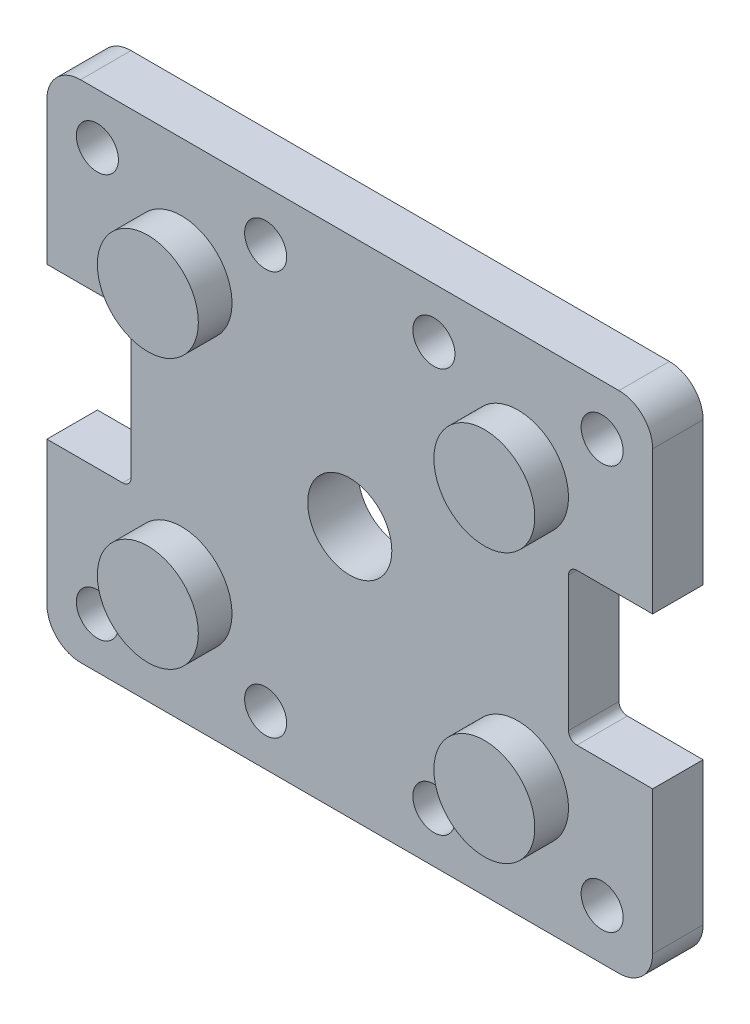
ISO-10303-21;
HEADER;
FILE_DESCRIPTION(('STEP AP214'),'2;1');
FILE_NAME('part.step','',(''),(''),'','','');
FILE_SCHEMA(('AUTOMOTIVE_DESIGN { 1 0 10303 214 1 1 1 1 }'));
ENDSEC;
DATA;
#1=APPLICATION_CONTEXT('core data for automotive mechanical design processes');
#2=APPLICATION_PROTOCOL_DEFINITION('international standard','automotive_design',2000,#1);
#3=PRODUCT_CONTEXT('',#1,'mechanical');
#4=PRODUCT('Part','Part','',(#3));
#5=PRODUCT_RELATED_PRODUCT_CATEGORY('part','',(#4));
#6=PRODUCT_DEFINITION_FORMATION('','',#4);
#7=PRODUCT_DEFINITION_CONTEXT('part definition',#1,'design');
#8=PRODUCT_DEFINITION('design','',#6,#7);
#9=PRODUCT_DEFINITION_SHAPE('','',#8);
#10=(LENGTH_UNIT() NAMED_UNIT(*) SI_UNIT(.MILLI.,.METRE.));
#11=(NAMED_UNIT(*) PLANE_ANGLE_UNIT() SI_UNIT($,.RADIAN.));
#12=(NAMED_UNIT(*) SI_UNIT($,.STERADIAN.) SOLID_ANGLE_UNIT());
#13=UNCERTAINTY_MEASURE_WITH_UNIT(LENGTH_MEASURE(1.E-05),#10,'distance_accuracy_value','');
#14=(GEOMETRIC_REPRESENTATION_CONTEXT(3) GLOBAL_UNCERTAINTY_ASSIGNED_CONTEXT((#13)) GLOBAL_UNIT_ASSIGNED_CONTEXT((#10,
#11,#12)) REPRESENTATION_CONTEXT('',''));
#15=CARTESIAN_POINT('',(0.,0.,0.));
#16=DIRECTION('',(0.,0.,1.));
#17=DIRECTION('',(1.,0.,0.));
#18=AXIS2_PLACEMENT_3D('',#15,#16,#17);
#19=CARTESIAN_POINT('',(36.,0.,3.));
#20=DIRECTION('',(-1.,0.,0.));
#21=DIRECTION('',(0.,0.,1.));
#22=AXIS2_PLACEMENT_3D('',#19,#20,#21);
#23=PLANE('',#22);
#24=DIRECTION('',(0.,1.,0.));
#25=VECTOR('',#24,1.);
#26=CARTESIAN_POINT('',(36.,0.,3.));
#27=LINE('',#26,#25);
#28=CARTESIAN_POINT('',(36.,2.,3.));
#29=VERTEX_POINT('',#28);
#30=CARTESIAN_POINT('',(36.,10.5,3.));
#31=VERTEX_POINT('',#30);
#32=EDGE_CURVE('E253',#29,#31,#27,.T.);
#33=ORIENTED_EDGE('',*,*,#32,.F.);
#34=DIRECTION('',(0.,0.,-1.));
#35=VECTOR('',#34,1.);
#36=CARTESIAN_POINT('',(36.,2.,3.));
#37=LINE('',#36,#35);
#38=CARTESIAN_POINT('',(36.,2.,0.));
#39=VERTEX_POINT('',#38);
#40=EDGE_CURVE('E182',#29,#39,#37,.T.);
#41=ORIENTED_EDGE('',*,*,#40,.T.);
#42=DIRECTION('',(0.,1.,0.));
#43=VECTOR('',#42,1.);
#44=CARTESIAN_POINT('',(36.,0.,0.));
#45=LINE('',#44,#43);
#46=CARTESIAN_POINT('',(36.,10.5,0.));
#47=VERTEX_POINT('',#46);
#48=EDGE_CURVE('E176',#39,#47,#45,.T.);
#49=ORIENTED_EDGE('',*,*,#48,.T.);
#50=DIRECTION('',(0.,0.,1.));
#51=VECTOR('',#50,1.);
#52=CARTESIAN_POINT('',(36.,10.5,0.));
#53=LINE('',#52,#51);
#54=EDGE_CURVE('E180',#47,#31,#53,.T.);
#55=ORIENTED_EDGE('',*,*,#54,.T.);
#56=EDGE_LOOP('',(#33,#41,#49,#55));
#57=FACE_BOUND('',#56,.T.);
#58=ADVANCED_FACE('F36',(#57),#23,.F.);
#59=CARTESIAN_POINT('',(0.,0.,3.));
#60=DIRECTION('',(1.,0.,0.));
#61=DIRECTION('',(0.,0.,-1.));
#62=AXIS2_PLACEMENT_3D('',#59,#60,#61);
#63=PLANE('',#62);
#64=DIRECTION('',(0.,-1.,0.));
#65=VECTOR('',#64,1.);
#66=CARTESIAN_POINT('',(0.,0.,3.));
#67=LINE('',#66,#65);
#68=CARTESIAN_POINT('',(0.,28.,3.));
#69=VERTEX_POINT('',#68);
#70=CARTESIAN_POINT('',(0.,19.5,3.));
#71=VERTEX_POINT('',#70);
#72=EDGE_CURVE('E246',#69,#71,#67,.T.);
#73=ORIENTED_EDGE('',*,*,#72,.F.);
#74=DIRECTION('',(0.,0.,-1.));
#75=VECTOR('',#74,1.);
#76=CARTESIAN_POINT('',(0.,28.,3.));
#77=LINE('',#76,#75);
#78=CARTESIAN_POINT('',(0.,28.,0.));
#79=VERTEX_POINT('',#78);
#80=EDGE_CURVE('E332',#69,#79,#77,.T.);
#81=ORIENTED_EDGE('',*,*,#80,.T.);
#82=DIRECTION('',(0.,-1.,0.));
#83=VECTOR('',#82,1.);
#84=CARTESIAN_POINT('',(0.,0.,0.));
#85=LINE('',#84,#83);
#86=CARTESIAN_POINT('',(0.,19.5,0.));
#87=VERTEX_POINT('',#86);
#88=EDGE_CURVE('E258',#79,#87,#85,.T.);
#89=ORIENTED_EDGE('',*,*,#88,.T.);
#90=DIRECTION('',(0.,0.,1.));
#91=VECTOR('',#90,1.);
#92=CARTESIAN_POINT('',(0.,19.5,0.));
#93=LINE('',#92,#91);
#94=EDGE_CURVE('E229',#87,#71,#93,.T.);
#95=ORIENTED_EDGE('',*,*,#94,.T.);
#96=EDGE_LOOP('',(#73,#81,#89,#95));
#97=FACE_BOUND('',#96,.T.);
#98=ADVANCED_FACE('F351',(#97),#63,.F.);
#99=CARTESIAN_POINT('',(0.,10.5,0.));
#100=VERTEX_POINT('',#99);
#101=CARTESIAN_POINT('',(0.,2.,0.));
#102=VERTEX_POINT('',#101);
#103=EDGE_CURVE('E245',#100,#102,#85,.T.);
#104=ORIENTED_EDGE('',*,*,#103,.T.);
#105=DIRECTION('',(0.,0.,-1.));
#106=VECTOR('',#105,1.);
#107=CARTESIAN_POINT('',(0.,2.,3.));
#108=LINE('',#107,#106);
#109=CARTESIAN_POINT('',(0.,2.,3.));
#110=VERTEX_POINT('',#109);
#111=EDGE_CURVE('E51',#102,#110,#108,.F.);
#112=ORIENTED_EDGE('',*,*,#111,.T.);
#113=CARTESIAN_POINT('',(0.,10.5,3.));
#114=VERTEX_POINT('',#113);
#115=EDGE_CURVE('E249',#114,#110,#67,.T.);
#116=ORIENTED_EDGE('',*,*,#115,.F.);
#117=DIRECTION('',(0.,0.,1.));
#118=VECTOR('',#117,1.);
#119=CARTESIAN_POINT('',(0.,10.5,0.));
#120=LINE('',#119,#118);
#121=EDGE_CURVE('E221',#100,#114,#120,.T.);
#122=ORIENTED_EDGE('',*,*,#121,.F.);
#123=EDGE_LOOP('',(#104,#112,#116,#122));
#124=FACE_BOUND('',#123,.T.);
#125=ADVANCED_FACE('F388',(#124),#63,.F.);
#126=CARTESIAN_POINT('',(0.,0.,3.));
#127=DIRECTION('',(0.,1.,0.));
#128=DIRECTION('',(0.,0.,1.));
#129=AXIS2_PLACEMENT_3D('',#126,#127,#128);
#130=PLANE('',#129);
#131=DIRECTION('',(1.,0.,0.));
#132=VECTOR('',#131,1.);
#133=CARTESIAN_POINT('',(0.,0.,0.));
#134=LINE('',#133,#132);
#135=CARTESIAN_POINT('',(2.,0.,0.));
#136=VERTEX_POINT('',#135);
#137=CARTESIAN_POINT('',(34.,0.,0.));
#138=VERTEX_POINT('',#137);
#139=EDGE_CURVE('E260',#136,#138,#134,.T.);
#140=ORIENTED_EDGE('',*,*,#139,.T.);
#141=DIRECTION('',(0.,0.,-1.));
#142=VECTOR('',#141,1.);
#143=CARTESIAN_POINT('',(34.,0.,3.));
#144=LINE('',#143,#142);
#145=CARTESIAN_POINT('',(34.,0.,3.));
#146=VERTEX_POINT('',#145);
#147=EDGE_CURVE('E322',#138,#146,#144,.F.);
#148=ORIENTED_EDGE('',*,*,#147,.T.);
#149=DIRECTION('',(1.,0.,0.));
#150=VECTOR('',#149,1.);
#151=CARTESIAN_POINT('',(0.,0.,3.));
#152=LINE('',#151,#150);
#153=CARTESIAN_POINT('',(2.,0.,3.));
#154=VERTEX_POINT('',#153);
#155=EDGE_CURVE('E248',#154,#146,#152,.T.);
#156=ORIENTED_EDGE('',*,*,#155,.F.);
#157=DIRECTION('',(0.,0.,-1.));
#158=VECTOR('',#157,1.);
#159=CARTESIAN_POINT('',(2.,0.,3.));
#160=LINE('',#159,#158);
#161=EDGE_CURVE('E319',#154,#136,#160,.T.);
#162=ORIENTED_EDGE('',*,*,#161,.T.);
#163=EDGE_LOOP('',(#140,#148,#156,#162));
#164=FACE_BOUND('',#163,.T.);
#165=ADVANCED_FACE('F393',(#164),#130,.F.);
#166=CARTESIAN_POINT('',(36.,19.5,0.));
#167=VERTEX_POINT('',#166);
#168=CARTESIAN_POINT('',(36.,28.,0.));
#169=VERTEX_POINT('',#168);
#170=EDGE_CURVE('E185',#167,#169,#45,.T.);
#171=ORIENTED_EDGE('',*,*,#170,.T.);
#172=DIRECTION('',(0.,0.,-1.));
#173=VECTOR('',#172,1.);
#174=CARTESIAN_POINT('',(36.,28.,3.));
#175=LINE('',#174,#173);
#176=CARTESIAN_POINT('',(36.,28.,3.));
#177=VERTEX_POINT('',#176);
#178=EDGE_CURVE('E11',#169,#177,#175,.F.);
#179=ORIENTED_EDGE('',*,*,#178,.T.);
#180=CARTESIAN_POINT('',(36.,19.5,3.));
#181=VERTEX_POINT('',#180);
#182=EDGE_CURVE('E252',#181,#177,#27,.T.);
#183=ORIENTED_EDGE('',*,*,#182,.F.);
#184=DIRECTION('',(0.,0.,1.));
#185=VECTOR('',#184,1.);
#186=CARTESIAN_POINT('',(36.,19.5,0.));
#187=LINE('',#186,#185);
#188=EDGE_CURVE('E203',#167,#181,#187,.T.);
#189=ORIENTED_EDGE('',*,*,#188,.F.);
#190=EDGE_LOOP('',(#171,#179,#183,#189));
#191=FACE_BOUND('',#190,.T.);
#192=ADVANCED_FACE('F384',(#191),#23,.F.);
#193=CARTESIAN_POINT('',(0.,30.,3.));
#194=DIRECTION('',(0.,-1.,0.));
#195=DIRECTION('',(0.,0.,-1.));
#196=AXIS2_PLACEMENT_3D('',#193,#194,#195);
#197=PLANE('',#196);
#198=DIRECTION('',(-1.,0.,0.));
#199=VECTOR('',#198,1.);
#200=CARTESIAN_POINT('',(0.,30.,0.));
#201=LINE('',#200,#199);
#202=CARTESIAN_POINT('',(34.,30.,0.));
#203=VERTEX_POINT('',#202);
#204=CARTESIAN_POINT('',(2.,30.,0.));
#205=VERTEX_POINT('',#204);
#206=EDGE_CURVE('E184',#203,#205,#201,.T.);
#207=ORIENTED_EDGE('',*,*,#206,.T.);
#208=DIRECTION('',(0.,0.,-1.));
#209=VECTOR('',#208,1.);
#210=CARTESIAN_POINT('',(2.,30.,3.));
#211=LINE('',#210,#209);
#212=CARTESIAN_POINT('',(2.,30.,3.));
#213=VERTEX_POINT('',#212);
#214=EDGE_CURVE('E44',#205,#213,#211,.F.);
#215=ORIENTED_EDGE('',*,*,#214,.T.);
#216=DIRECTION('',(-1.,0.,0.));
#217=VECTOR('',#216,1.);
#218=CARTESIAN_POINT('',(0.,30.,3.));
#219=LINE('',#218,#217);
#220=CARTESIAN_POINT('',(34.,30.,3.));
#221=VERTEX_POINT('',#220);
#222=EDGE_CURVE('E255',#221,#213,#219,.T.);
#223=ORIENTED_EDGE('',*,*,#222,.F.);
#224=DIRECTION('',(0.,0.,-1.));
#225=VECTOR('',#224,1.);
#226=CARTESIAN_POINT('',(34.,30.,3.));
#227=LINE('',#226,#225);
#228=EDGE_CURVE('E335',#221,#203,#227,.T.);
#229=ORIENTED_EDGE('',*,*,#228,.T.);
#230=EDGE_LOOP('',(#207,#215,#223,#229));
#231=FACE_BOUND('',#230,.T.);
#232=ADVANCED_FACE('F340',(#231),#197,.F.);
#233=CARTESIAN_POINT('',(0.,0.,3.));
#234=DIRECTION('',(0.,0.,-1.));
#235=DIRECTION('',(-1.,0.,0.));
#236=AXIS2_PLACEMENT_3D('',#233,#234,#235);
#237=PLANE('',#236);
#238=CARTESIAN_POINT('',(3.,27.,3.));
#239=DIRECTION('',(0.,0.,1.));
#240=DIRECTION('',(1.,0.,0.));
#241=AXIS2_PLACEMENT_3D('',#238,#239,#240);
#242=CIRCLE('',#241,1.25);
#243=CARTESIAN_POINT('',(4.25,27.,3.));
#244=VERTEX_POINT('',#243);
#245=EDGE_CURVE('E853',#244,#244,#242,.T.);
#246=ORIENTED_EDGE('',*,*,#245,.F.);
#247=EDGE_LOOP('',(#246));
#248=FACE_BOUND('',#247,.T.);
#249=CARTESIAN_POINT('',(13.,27.,3.));
#250=DIRECTION('',(0.,0.,1.));
#251=DIRECTION('',(1.,0.,0.));
#252=AXIS2_PLACEMENT_3D('',#249,#250,#251);
#253=CIRCLE('',#252,1.25);
#254=CARTESIAN_POINT('',(14.25,27.,3.));
#255=VERTEX_POINT('',#254);
#256=EDGE_CURVE('E849',#255,#255,#253,.T.);
#257=ORIENTED_EDGE('',*,*,#256,.F.);
#258=EDGE_LOOP('',(#257));
#259=FACE_BOUND('',#258,.T.);
#260=CARTESIAN_POINT('',(23.,27.,3.));
#261=DIRECTION('',(0.,0.,1.));
#262=DIRECTION('',(1.,0.,0.));
#263=AXIS2_PLACEMENT_3D('',#260,#261,#262);
#264=CIRCLE('',#263,1.25);
#265=CARTESIAN_POINT('',(24.25,27.,3.));
#266=VERTEX_POINT('',#265);
#267=EDGE_CURVE('E845',#266,#266,#264,.T.);
#268=ORIENTED_EDGE('',*,*,#267,.F.);
#269=EDGE_LOOP('',(#268));
#270=FACE_BOUND('',#269,.T.);
#271=CARTESIAN_POINT('',(33.,27.,3.));
#272=DIRECTION('',(0.,0.,1.));
#273=DIRECTION('',(1.,0.,0.));
#274=AXIS2_PLACEMENT_3D('',#271,#272,#273);
#275=CIRCLE('',#274,1.25);
#276=CARTESIAN_POINT('',(34.25,27.,3.));
#277=VERTEX_POINT('',#276);
#278=EDGE_CURVE('E841',#277,#277,#275,.T.);
#279=ORIENTED_EDGE('',*,*,#278,.F.);
#280=EDGE_LOOP('',(#279));
#281=FACE_BOUND('',#280,.T.);
#282=CARTESIAN_POINT('',(33.,3.,3.));
#283=DIRECTION('',(0.,0.,1.));
#284=DIRECTION('',(1.,0.,0.));
#285=AXIS2_PLACEMENT_3D('',#282,#283,#284);
#286=CIRCLE('',#285,1.25);
#287=CARTESIAN_POINT('',(34.25,3.,3.));
#288=VERTEX_POINT('',#287);
#289=EDGE_CURVE('E837',#288,#288,#286,.T.);
#290=ORIENTED_EDGE('',*,*,#289,.F.);
#291=EDGE_LOOP('',(#290));
#292=FACE_BOUND('',#291,.T.);
#293=CARTESIAN_POINT('',(23.,3.,3.));
#294=DIRECTION('',(0.,0.,1.));
#295=DIRECTION('',(1.,0.,0.));
#296=AXIS2_PLACEMENT_3D('',#293,#294,#295);
#297=CIRCLE('',#296,1.25);
#298=CARTESIAN_POINT('',(24.25,3.,3.));
#299=VERTEX_POINT('',#298);
#300=EDGE_CURVE('E826',#299,#299,#297,.T.);
#301=ORIENTED_EDGE('',*,*,#300,.F.);
#302=EDGE_LOOP('',(#301));
#303=FACE_BOUND('',#302,.T.);
#304=CARTESIAN_POINT('',(13.,3.,3.));
#305=DIRECTION('',(0.,0.,1.));
#306=DIRECTION('',(1.,0.,0.));
#307=AXIS2_PLACEMENT_3D('',#304,#305,#306);
#308=CIRCLE('',#307,1.25);
#309=CARTESIAN_POINT('',(14.25,3.,3.));
#310=VERTEX_POINT('',#309);
#311=EDGE_CURVE('E821',#310,#310,#308,.T.);
#312=ORIENTED_EDGE('',*,*,#311,.F.);
#313=EDGE_LOOP('',(#312));
#314=FACE_BOUND('',#313,.T.);
#315=CARTESIAN_POINT('',(3.,3.,3.));
#316=DIRECTION('',(0.,0.,1.));
#317=DIRECTION('',(1.,0.,0.));
#318=AXIS2_PLACEMENT_3D('',#315,#316,#317);
#319=CIRCLE('',#318,1.25);
#320=CARTESIAN_POINT('',(4.25,3.,3.));
#321=VERTEX_POINT('',#320);
#322=EDGE_CURVE('E824',#321,#321,#319,.T.);
#323=ORIENTED_EDGE('',*,*,#322,.F.);
#324=EDGE_LOOP('',(#323));
#325=FACE_BOUND('',#324,.T.);
#326=CARTESIAN_POINT('',(18.,15.,3.));
#327=DIRECTION('',(0.,0.,1.));
#328=DIRECTION('',(1.,0.,0.));
#329=AXIS2_PLACEMENT_3D('',#326,#327,#328);
#330=CIRCLE('',#329,2.49999999999999);
#331=CARTESIAN_POINT('',(20.5,15.,3.));
#332=VERTEX_POINT('',#331);
#333=EDGE_CURVE('E526',#332,#332,#330,.T.);
#334=ORIENTED_EDGE('',*,*,#333,.F.);
#335=EDGE_LOOP('',(#334));
#336=FACE_BOUND('',#335,.T.);
#337=CARTESIAN_POINT('',(28.,23.,3.));
#338=DIRECTION('',(0.,0.,-1.));
#339=DIRECTION('',(-1.,0.,0.));
#340=AXIS2_PLACEMENT_3D('',#337,#338,#339);
#341=CIRCLE('',#340,3.);
#342=CARTESIAN_POINT('',(25.,23.,3.));
#343=VERTEX_POINT('',#342);
#344=EDGE_CURVE('E273',#343,#343,#341,.F.);
#345=ORIENTED_EDGE('',*,*,#344,.F.);
#346=EDGE_LOOP('',(#345));
#347=FACE_BOUND('',#346,.T.);
#348=CARTESIAN_POINT('',(28.,7.,3.));
#349=DIRECTION('',(0.,0.,-1.));
#350=DIRECTION('',(-1.,0.,0.));
#351=AXIS2_PLACEMENT_3D('',#348,#349,#350);
#352=CIRCLE('',#351,3.);
#353=CARTESIAN_POINT('',(25.,7.,3.));
#354=VERTEX_POINT('',#353);
#355=EDGE_CURVE('E270',#354,#354,#352,.F.);
#356=ORIENTED_EDGE('',*,*,#355,.F.);
#357=EDGE_LOOP('',(#356));
#358=FACE_BOUND('',#357,.T.);
#359=CARTESIAN_POINT('',(8.,7.,3.));
#360=DIRECTION('',(0.,0.,-1.));
#361=DIRECTION('',(-1.,0.,0.));
#362=AXIS2_PLACEMENT_3D('',#359,#360,#361);
#363=CIRCLE('',#362,3.);
#364=CARTESIAN_POINT('',(5.,7.,3.));
#365=VERTEX_POINT('',#364);
#366=EDGE_CURVE('E267',#365,#365,#363,.F.);
#367=ORIENTED_EDGE('',*,*,#366,.F.);
#368=EDGE_LOOP('',(#367));
#369=FACE_BOUND('',#368,.T.);
#370=CARTESIAN_POINT('',(8.,23.,3.));
#371=DIRECTION('',(0.,0.,-1.));
#372=DIRECTION('',(-1.,0.,0.));
#373=AXIS2_PLACEMENT_3D('',#370,#371,#372);
#374=CIRCLE('',#373,3.);
#375=CARTESIAN_POINT('',(5.,23.,3.));
#376=VERTEX_POINT('',#375);
#377=EDGE_CURVE('E257',#376,#376,#374,.F.);
#378=ORIENTED_EDGE('',*,*,#377,.F.);
#379=EDGE_LOOP('',(#378));
#380=FACE_BOUND('',#379,.T.);
#381=ORIENTED_EDGE('',*,*,#155,.T.);
#382=CARTESIAN_POINT('',(34.,2.,3.));
#383=DIRECTION('',(0.,0.,-1.));
#384=DIRECTION('',(-1.,0.,0.));
#385=AXIS2_PLACEMENT_3D('',#382,#383,#384);
#386=CIRCLE('',#385,2.);
#387=EDGE_CURVE('E329',#146,#29,#386,.F.);
#388=ORIENTED_EDGE('',*,*,#387,.T.);
#389=ORIENTED_EDGE('',*,*,#32,.T.);
#390=DIRECTION('',(1.,0.,0.));
#391=VECTOR('',#390,1.);
#392=CARTESIAN_POINT('',(31.,10.5,3.));
#393=LINE('',#392,#391);
#394=CARTESIAN_POINT('',(31.5,10.5,3.));
#395=VERTEX_POINT('',#394);
#396=EDGE_CURVE('E202',#395,#31,#393,.T.);
#397=ORIENTED_EDGE('',*,*,#396,.F.);
#398=CARTESIAN_POINT('',(31.5,11.,3.));
#399=DIRECTION('',(0.,0.,-1.));
#400=DIRECTION('',(-1.,0.,0.));
#401=AXIS2_PLACEMENT_3D('',#398,#399,#400);
#402=CIRCLE('',#401,0.5);
#403=CARTESIAN_POINT('',(31.,11.,3.));
#404=VERTEX_POINT('',#403);
#405=EDGE_CURVE('E299',#395,#404,#402,.T.);
#406=ORIENTED_EDGE('',*,*,#405,.T.);
#407=DIRECTION('',(0.,-1.,0.));
#408=VECTOR('',#407,1.);
#409=CARTESIAN_POINT('',(31.,10.5,3.));
#410=LINE('',#409,#408);
#411=CARTESIAN_POINT('',(31.,19.,3.));
#412=VERTEX_POINT('',#411);
#413=EDGE_CURVE('E197',#412,#404,#410,.T.);
#414=ORIENTED_EDGE('',*,*,#413,.F.);
#415=CARTESIAN_POINT('',(31.5,19.,3.));
#416=DIRECTION('',(0.,0.,-1.));
#417=DIRECTION('',(-1.,0.,0.));
#418=AXIS2_PLACEMENT_3D('',#415,#416,#417);
#419=CIRCLE('',#418,0.5);
#420=CARTESIAN_POINT('',(31.5,19.5,3.));
#421=VERTEX_POINT('',#420);
#422=EDGE_CURVE('E295',#412,#421,#419,.T.);
#423=ORIENTED_EDGE('',*,*,#422,.T.);
#424=DIRECTION('',(-1.,0.,0.));
#425=VECTOR('',#424,1.);
#426=CARTESIAN_POINT('',(31.,19.5,3.));
#427=LINE('',#426,#425);
#428=EDGE_CURVE('E528',#181,#421,#427,.T.);
#429=ORIENTED_EDGE('',*,*,#428,.F.);
#430=ORIENTED_EDGE('',*,*,#182,.T.);
#431=CARTESIAN_POINT('',(34.,28.,3.));
#432=DIRECTION('',(0.,0.,-1.));
#433=DIRECTION('',(-1.,0.,0.));
#434=AXIS2_PLACEMENT_3D('',#431,#432,#433);
#435=CIRCLE('',#434,2.);
#436=EDGE_CURVE('E324',#177,#221,#435,.F.);
#437=ORIENTED_EDGE('',*,*,#436,.T.);
#438=ORIENTED_EDGE('',*,*,#222,.T.);
#439=CARTESIAN_POINT('',(2.,28.,3.));
#440=DIRECTION('',(0.,0.,-1.));
#441=DIRECTION('',(-1.,0.,0.));
#442=AXIS2_PLACEMENT_3D('',#439,#440,#441);
#443=CIRCLE('',#442,2.);
#444=EDGE_CURVE('E59',#213,#69,#443,.F.);
#445=ORIENTED_EDGE('',*,*,#444,.T.);
#446=ORIENTED_EDGE('',*,*,#72,.T.);
#447=DIRECTION('',(-1.,0.,0.));
#448=VECTOR('',#447,1.);
#449=CARTESIAN_POINT('',(5.,19.5,3.));
#450=LINE('',#449,#448);
#451=CARTESIAN_POINT('',(4.5,19.5,3.));
#452=VERTEX_POINT('',#451);
#453=EDGE_CURVE('E215',#452,#71,#450,.T.);
#454=ORIENTED_EDGE('',*,*,#453,.F.);
#455=CARTESIAN_POINT('',(4.5,19.,3.));
#456=DIRECTION('',(0.,0.,-1.));
#457=DIRECTION('',(-1.,0.,0.));
#458=AXIS2_PLACEMENT_3D('',#455,#456,#457);
#459=CIRCLE('',#458,0.5);
#460=CARTESIAN_POINT('',(5.,19.,3.));
#461=VERTEX_POINT('',#460);
#462=EDGE_CURVE('E306',#452,#461,#459,.T.);
#463=ORIENTED_EDGE('',*,*,#462,.T.);
#464=DIRECTION('',(0.,1.,0.));
#465=VECTOR('',#464,1.);
#466=CARTESIAN_POINT('',(5.,10.5,3.));
#467=LINE('',#466,#465);
#468=CARTESIAN_POINT('',(5.,11.,3.));
#469=VERTEX_POINT('',#468);
#470=EDGE_CURVE('E224',#469,#461,#467,.T.);
#471=ORIENTED_EDGE('',*,*,#470,.F.);
#472=CARTESIAN_POINT('',(4.5,11.,3.));
#473=DIRECTION('',(0.,0.,-1.));
#474=DIRECTION('',(-1.,0.,0.));
#475=AXIS2_PLACEMENT_3D('',#472,#473,#474);
#476=CIRCLE('',#475,0.5);
#477=CARTESIAN_POINT('',(4.5,10.5,3.));
#478=VERTEX_POINT('',#477);
#479=EDGE_CURVE('E302',#469,#478,#476,.T.);
#480=ORIENTED_EDGE('',*,*,#479,.T.);
#481=DIRECTION('',(1.,0.,0.));
#482=VECTOR('',#481,1.);
#483=CARTESIAN_POINT('',(5.,10.5,3.));
#484=LINE('',#483,#482);
#485=EDGE_CURVE('E206',#114,#478,#484,.T.);
#486=ORIENTED_EDGE('',*,*,#485,.F.);
#487=ORIENTED_EDGE('',*,*,#115,.T.);
#488=CARTESIAN_POINT('',(2.,2.,3.));
#489=DIRECTION('',(0.,0.,-1.));
#490=DIRECTION('',(-1.,0.,0.));
#491=AXIS2_PLACEMENT_3D('',#488,#489,#490);
#492=CIRCLE('',#491,2.);
#493=EDGE_CURVE('E327',#110,#154,#492,.F.);
#494=ORIENTED_EDGE('',*,*,#493,.T.);
#495=EDGE_LOOP('',(#381,#388,#389,#397,#406,#414,#423,#429,#430,#437,#438,#445,#446,#454,#463,
#471,#480,#486,#487,#494));
#496=FACE_BOUND('',#495,.T.);
#497=ADVANCED_FACE('F344',(#248,#259,#270,#281,#292,#303,#314,#325,#336,#347,#358,#369,#380,
#496),#237,.F.);
#498=CARTESIAN_POINT('',(0.,0.,0.));
#499=DIRECTION('',(0.,0.,-1.));
#500=DIRECTION('',(-1.,0.,0.));
#501=AXIS2_PLACEMENT_3D('',#498,#499,#500);
#502=PLANE('',#501);
#503=CARTESIAN_POINT('',(3.,27.,0.));
#504=DIRECTION('',(0.,0.,1.));
#505=DIRECTION('',(1.,0.,0.));
#506=AXIS2_PLACEMENT_3D('',#503,#504,#505);
#507=CIRCLE('',#506,1.25);
#508=CARTESIAN_POINT('',(4.25,27.,0.));
#509=VERTEX_POINT('',#508);
#510=EDGE_CURVE('E493',#509,#509,#507,.T.);
#511=ORIENTED_EDGE('',*,*,#510,.T.);
#512=EDGE_LOOP('',(#511));
#513=FACE_BOUND('',#512,.T.);
#514=CARTESIAN_POINT('',(13.,27.,0.));
#515=DIRECTION('',(0.,0.,1.));
#516=DIRECTION('',(1.,0.,0.));
#517=AXIS2_PLACEMENT_3D('',#514,#515,#516);
#518=CIRCLE('',#517,1.25);
#519=CARTESIAN_POINT('',(14.25,27.,0.));
#520=VERTEX_POINT('',#519);
#521=EDGE_CURVE('E497',#520,#520,#518,.T.);
#522=ORIENTED_EDGE('',*,*,#521,.T.);
#523=EDGE_LOOP('',(#522));
#524=FACE_BOUND('',#523,.T.);
#525=CARTESIAN_POINT('',(23.,27.,0.));
#526=DIRECTION('',(0.,0.,1.));
#527=DIRECTION('',(1.,0.,0.));
#528=AXIS2_PLACEMENT_3D('',#525,#526,#527);
#529=CIRCLE('',#528,1.25);
#530=CARTESIAN_POINT('',(24.25,27.,0.));
#531=VERTEX_POINT('',#530);
#532=EDGE_CURVE('E501',#531,#531,#529,.T.);
#533=ORIENTED_EDGE('',*,*,#532,.T.);
#534=EDGE_LOOP('',(#533));
#535=FACE_BOUND('',#534,.T.);
#536=CARTESIAN_POINT('',(33.,27.,0.));
#537=DIRECTION('',(0.,0.,1.));
#538=DIRECTION('',(1.,0.,0.));
#539=AXIS2_PLACEMENT_3D('',#536,#537,#538);
#540=CIRCLE('',#539,1.25);
#541=CARTESIAN_POINT('',(34.25,27.,0.));
#542=VERTEX_POINT('',#541);
#543=EDGE_CURVE('E505',#542,#542,#540,.T.);
#544=ORIENTED_EDGE('',*,*,#543,.T.);
#545=EDGE_LOOP('',(#544));
#546=FACE_BOUND('',#545,.T.);
#547=CARTESIAN_POINT('',(33.,3.,0.));
#548=DIRECTION('',(0.,0.,1.));
#549=DIRECTION('',(1.,0.,0.));
#550=AXIS2_PLACEMENT_3D('',#547,#548,#549);
#551=CIRCLE('',#550,1.25);
#552=CARTESIAN_POINT('',(34.25,3.,0.));
#553=VERTEX_POINT('',#552);
#554=EDGE_CURVE('E509',#553,#553,#551,.T.);
#555=ORIENTED_EDGE('',*,*,#554,.T.);
#556=EDGE_LOOP('',(#555));
#557=FACE_BOUND('',#556,.T.);
#558=CARTESIAN_POINT('',(23.,3.,0.));
#559=DIRECTION('',(0.,0.,1.));
#560=DIRECTION('',(1.,0.,0.));
#561=AXIS2_PLACEMENT_3D('',#558,#559,#560);
#562=CIRCLE('',#561,1.25);
#563=CARTESIAN_POINT('',(24.25,3.,0.));
#564=VERTEX_POINT('',#563);
#565=EDGE_CURVE('E513',#564,#564,#562,.T.);
#566=ORIENTED_EDGE('',*,*,#565,.T.);
#567=EDGE_LOOP('',(#566));
#568=FACE_BOUND('',#567,.T.);
#569=CARTESIAN_POINT('',(13.,3.,0.));
#570=DIRECTION('',(0.,0.,1.));
#571=DIRECTION('',(1.,0.,0.));
#572=AXIS2_PLACEMENT_3D('',#569,#570,#571);
#573=CIRCLE('',#572,1.25);
#574=CARTESIAN_POINT('',(14.25,3.,0.));
#575=VERTEX_POINT('',#574);
#576=EDGE_CURVE('E517',#575,#575,#573,.T.);
#577=ORIENTED_EDGE('',*,*,#576,.T.);
#578=EDGE_LOOP('',(#577));
#579=FACE_BOUND('',#578,.T.);
#580=CARTESIAN_POINT('',(3.,3.,0.));
#581=DIRECTION('',(0.,0.,1.));
#582=DIRECTION('',(1.,0.,0.));
#583=AXIS2_PLACEMENT_3D('',#580,#581,#582);
#584=CIRCLE('',#583,1.25);
#585=CARTESIAN_POINT('',(4.25,3.,0.));
#586=VERTEX_POINT('',#585);
#587=EDGE_CURVE('E521',#586,#586,#584,.T.);
#588=ORIENTED_EDGE('',*,*,#587,.T.);
#589=EDGE_LOOP('',(#588));
#590=FACE_BOUND('',#589,.T.);
#591=CARTESIAN_POINT('',(18.,15.,0.));
#592=DIRECTION('',(0.,0.,1.));
#593=DIRECTION('',(1.,0.,0.));
#594=AXIS2_PLACEMENT_3D('',#591,#592,#593);
#595=CIRCLE('',#594,2.5);
#596=CARTESIAN_POINT('',(20.5,15.,0.));
#597=VERTEX_POINT('',#596);
#598=EDGE_CURVE('E524',#597,#597,#595,.T.);
#599=ORIENTED_EDGE('',*,*,#598,.T.);
#600=EDGE_LOOP('',(#599));
#601=FACE_BOUND('',#600,.T.);
#602=ORIENTED_EDGE('',*,*,#48,.F.);
#603=CARTESIAN_POINT('',(34.,2.,0.));
#604=DIRECTION('',(0.,0.,-1.));
#605=DIRECTION('',(-1.,0.,0.));
#606=AXIS2_PLACEMENT_3D('',#603,#604,#605);
#607=CIRCLE('',#606,2.);
#608=EDGE_CURVE('E317',#39,#138,#607,.T.);
#609=ORIENTED_EDGE('',*,*,#608,.T.);
#610=ORIENTED_EDGE('',*,*,#139,.F.);
#611=CARTESIAN_POINT('',(2.,2.,0.));
#612=DIRECTION('',(0.,0.,-1.));
#613=DIRECTION('',(-1.,0.,0.));
#614=AXIS2_PLACEMENT_3D('',#611,#612,#613);
#615=CIRCLE('',#614,2.);
#616=EDGE_CURVE('E315',#136,#102,#615,.T.);
#617=ORIENTED_EDGE('',*,*,#616,.T.);
#618=ORIENTED_EDGE('',*,*,#103,.F.);
#619=DIRECTION('',(1.,0.,0.));
#620=VECTOR('',#619,1.);
#621=CARTESIAN_POINT('',(5.,10.5,0.));
#622=LINE('',#621,#620);
#623=CARTESIAN_POINT('',(4.5,10.5,0.));
#624=VERTEX_POINT('',#623);
#625=EDGE_CURVE('E211',#100,#624,#622,.T.);
#626=ORIENTED_EDGE('',*,*,#625,.T.);
#627=CARTESIAN_POINT('',(4.5,11.,0.));
#628=DIRECTION('',(0.,0.,-1.));
#629=DIRECTION('',(-1.,0.,0.));
#630=AXIS2_PLACEMENT_3D('',#627,#628,#629);
#631=CIRCLE('',#630,0.5);
#632=CARTESIAN_POINT('',(5.,11.,0.));
#633=VERTEX_POINT('',#632);
#634=EDGE_CURVE('E304',#624,#633,#631,.F.);
#635=ORIENTED_EDGE('',*,*,#634,.T.);
#636=DIRECTION('',(0.,1.,0.));
#637=VECTOR('',#636,1.);
#638=CARTESIAN_POINT('',(5.,10.5,0.));
#639=LINE('',#638,#637);
#640=CARTESIAN_POINT('',(5.,19.,0.));
#641=VERTEX_POINT('',#640);
#642=EDGE_CURVE('E214',#633,#641,#639,.T.);
#643=ORIENTED_EDGE('',*,*,#642,.T.);
#644=CARTESIAN_POINT('',(4.5,19.,0.));
#645=DIRECTION('',(0.,0.,-1.));
#646=DIRECTION('',(-1.,0.,0.));
#647=AXIS2_PLACEMENT_3D('',#644,#645,#646);
#648=CIRCLE('',#647,0.5);
#649=CARTESIAN_POINT('',(4.5,19.5,0.));
#650=VERTEX_POINT('',#649);
#651=EDGE_CURVE('E308',#641,#650,#648,.F.);
#652=ORIENTED_EDGE('',*,*,#651,.T.);
#653=DIRECTION('',(-1.,0.,0.));
#654=VECTOR('',#653,1.);
#655=CARTESIAN_POINT('',(5.,19.5,0.));
#656=LINE('',#655,#654);
#657=EDGE_CURVE('E218',#650,#87,#656,.T.);
#658=ORIENTED_EDGE('',*,*,#657,.T.);
#659=ORIENTED_EDGE('',*,*,#88,.F.);
#660=CARTESIAN_POINT('',(2.,28.,0.));
#661=DIRECTION('',(0.,0.,-1.));
#662=DIRECTION('',(-1.,0.,0.));
#663=AXIS2_PLACEMENT_3D('',#660,#661,#662);
#664=CIRCLE('',#663,2.);
#665=EDGE_CURVE('E313',#79,#205,#664,.T.);
#666=ORIENTED_EDGE('',*,*,#665,.T.);
#667=ORIENTED_EDGE('',*,*,#206,.F.);
#668=CARTESIAN_POINT('',(34.,28.,0.));
#669=DIRECTION('',(0.,0.,-1.));
#670=DIRECTION('',(-1.,0.,0.));
#671=AXIS2_PLACEMENT_3D('',#668,#669,#670);
#672=CIRCLE('',#671,2.);
#673=EDGE_CURVE('E311',#203,#169,#672,.T.);
#674=ORIENTED_EDGE('',*,*,#673,.T.);
#675=ORIENTED_EDGE('',*,*,#170,.F.);
#676=DIRECTION('',(-1.,0.,0.));
#677=VECTOR('',#676,1.);
#678=CARTESIAN_POINT('',(31.,19.5,0.));
#679=LINE('',#678,#677);
#680=CARTESIAN_POINT('',(31.5,19.5,0.));
#681=VERTEX_POINT('',#680);
#682=EDGE_CURVE('E196',#167,#681,#679,.T.);
#683=ORIENTED_EDGE('',*,*,#682,.T.);
#684=CARTESIAN_POINT('',(31.5,19.,0.));
#685=DIRECTION('',(0.,0.,-1.));
#686=DIRECTION('',(-1.,0.,0.));
#687=AXIS2_PLACEMENT_3D('',#684,#685,#686);
#688=CIRCLE('',#687,0.5);
#689=CARTESIAN_POINT('',(31.,19.,0.));
#690=VERTEX_POINT('',#689);
#691=EDGE_CURVE('E297',#681,#690,#688,.F.);
#692=ORIENTED_EDGE('',*,*,#691,.T.);
#693=DIRECTION('',(0.,-1.,0.));
#694=VECTOR('',#693,1.);
#695=CARTESIAN_POINT('',(31.,10.5,0.));
#696=LINE('',#695,#694);
#697=CARTESIAN_POINT('',(31.,11.,0.));
#698=VERTEX_POINT('',#697);
#699=EDGE_CURVE('E204',#690,#698,#696,.T.);
#700=ORIENTED_EDGE('',*,*,#699,.T.);
#701=CARTESIAN_POINT('',(31.5,11.,0.));
#702=DIRECTION('',(0.,0.,-1.));
#703=DIRECTION('',(-1.,0.,0.));
#704=AXIS2_PLACEMENT_3D('',#701,#702,#703);
#705=CIRCLE('',#704,0.5);
#706=CARTESIAN_POINT('',(31.5,10.5,0.));
#707=VERTEX_POINT('',#706);
#708=EDGE_CURVE('E192',#698,#707,#705,.F.);
#709=ORIENTED_EDGE('',*,*,#708,.T.);
#710=DIRECTION('',(1.,0.,0.));
#711=VECTOR('',#710,1.);
#712=CARTESIAN_POINT('',(31.,10.5,0.));
#713=LINE('',#712,#711);
#714=EDGE_CURVE('E188',#707,#47,#713,.T.);
#715=ORIENTED_EDGE('',*,*,#714,.T.);
#716=EDGE_LOOP('',(#602,#609,#610,#617,#618,#626,#635,#643,#652,#658,#659,#666,#667,#674,#675,
#683,#692,#700,#709,#715));
#717=FACE_BOUND('',#716,.T.);
#718=ADVANCED_FACE('F189',(#513,#524,#535,#546,#557,#568,#579,#590,#601,#717),#502,.T.);
#719=CARTESIAN_POINT('',(8.,23.,5.));
#720=DIRECTION('',(0.,0.,-1.));
#721=DIRECTION('',(-1.,0.,0.));
#722=AXIS2_PLACEMENT_3D('',#719,#720,#721);
#723=CYLINDRICAL_SURFACE('',#722,3.);
#724=CARTESIAN_POINT('',(8.,23.,5.));
#725=DIRECTION('',(0.,0.,1.));
#726=DIRECTION('',(1.,0.,0.));
#727=AXIS2_PLACEMENT_3D('',#724,#725,#726);
#728=CIRCLE('',#727,3.);
#729=CARTESIAN_POINT('',(11.,23.,5.));
#730=VERTEX_POINT('',#729);
#731=EDGE_CURVE('E242',#730,#730,#728,.T.);
#732=ORIENTED_EDGE('',*,*,#731,.F.);
#733=EDGE_LOOP('',(#732));
#734=FACE_BOUND('',#733,.T.);
#735=ORIENTED_EDGE('',*,*,#377,.T.);
#736=EDGE_LOOP('',(#735));
#737=FACE_BOUND('',#736,.T.);
#738=ADVANCED_FACE('F478',(#734,#737),#723,.T.);
#739=CARTESIAN_POINT('',(8.,23.,5.));
#740=DIRECTION('',(0.,0.,1.));
#741=DIRECTION('',(1.,0.,0.));
#742=AXIS2_PLACEMENT_3D('',#739,#740,#741);
#743=PLANE('',#742);
#744=ORIENTED_EDGE('',*,*,#731,.T.);
#745=EDGE_LOOP('',(#744));
#746=FACE_BOUND('',#745,.T.);
#747=ADVANCED_FACE('F474',(#746),#743,.T.);
#748=CARTESIAN_POINT('',(8.,7.,5.));
#749=DIRECTION('',(0.,0.,-1.));
#750=DIRECTION('',(-1.,0.,0.));
#751=AXIS2_PLACEMENT_3D('',#748,#749,#750);
#752=CYLINDRICAL_SURFACE('',#751,3.);
#753=CARTESIAN_POINT('',(8.,7.,5.));
#754=DIRECTION('',(0.,0.,1.));
#755=DIRECTION('',(1.,0.,0.));
#756=AXIS2_PLACEMENT_3D('',#753,#754,#755);
#757=CIRCLE('',#756,3.);
#758=CARTESIAN_POINT('',(11.,7.,5.));
#759=VERTEX_POINT('',#758);
#760=EDGE_CURVE('E239',#759,#759,#757,.T.);
#761=ORIENTED_EDGE('',*,*,#760,.F.);
#762=EDGE_LOOP('',(#761));
#763=FACE_BOUND('',#762,.T.);
#764=ORIENTED_EDGE('',*,*,#366,.T.);
#765=EDGE_LOOP('',(#764));
#766=FACE_BOUND('',#765,.T.);
#767=ADVANCED_FACE('F470',(#763,#766),#752,.T.);
#768=CARTESIAN_POINT('',(8.,7.,5.));
#769=DIRECTION('',(0.,0.,1.));
#770=DIRECTION('',(1.,0.,0.));
#771=AXIS2_PLACEMENT_3D('',#768,#769,#770);
#772=PLANE('',#771);
#773=ORIENTED_EDGE('',*,*,#760,.T.);
#774=EDGE_LOOP('',(#773));
#775=FACE_BOUND('',#774,.T.);
#776=ADVANCED_FACE('F466',(#775),#772,.T.);
#777=CARTESIAN_POINT('',(28.,7.,5.));
#778=DIRECTION('',(0.,0.,-1.));
#779=DIRECTION('',(-1.,0.,0.));
#780=AXIS2_PLACEMENT_3D('',#777,#778,#779);
#781=CYLINDRICAL_SURFACE('',#780,3.);
#782=CARTESIAN_POINT('',(28.,7.,5.));
#783=DIRECTION('',(0.,0.,1.));
#784=DIRECTION('',(-1.,0.,0.));
#785=AXIS2_PLACEMENT_3D('',#782,#783,#784);
#786=CIRCLE('',#785,3.);
#787=CARTESIAN_POINT('',(25.,7.,5.));
#788=VERTEX_POINT('',#787);
#789=EDGE_CURVE('E236',#788,#788,#786,.T.);
#790=ORIENTED_EDGE('',*,*,#789,.F.);
#791=EDGE_LOOP('',(#790));
#792=FACE_BOUND('',#791,.T.);
#793=ORIENTED_EDGE('',*,*,#355,.T.);
#794=EDGE_LOOP('',(#793));
#795=FACE_BOUND('',#794,.T.);
#796=ADVANCED_FACE('F462',(#792,#795),#781,.T.);
#797=CARTESIAN_POINT('',(28.,7.,5.));
#798=DIRECTION('',(0.,0.,-1.));
#799=DIRECTION('',(-1.,0.,0.));
#800=AXIS2_PLACEMENT_3D('',#797,#798,#799);
#801=PLANE('',#800);
#802=ORIENTED_EDGE('',*,*,#789,.T.);
#803=EDGE_LOOP('',(#802));
#804=FACE_BOUND('',#803,.T.);
#805=ADVANCED_FACE('F458',(#804),#801,.F.);
#806=CARTESIAN_POINT('',(28.,23.,5.));
#807=DIRECTION('',(0.,0.,-1.));
#808=DIRECTION('',(-1.,0.,0.));
#809=AXIS2_PLACEMENT_3D('',#806,#807,#808);
#810=CYLINDRICAL_SURFACE('',#809,3.);
#811=CARTESIAN_POINT('',(28.,23.,5.));
#812=DIRECTION('',(0.,0.,1.));
#813=DIRECTION('',(-1.,0.,0.));
#814=AXIS2_PLACEMENT_3D('',#811,#812,#813);
#815=CIRCLE('',#814,3.);
#816=CARTESIAN_POINT('',(25.,23.,5.));
#817=VERTEX_POINT('',#816);
#818=EDGE_CURVE('E232',#817,#817,#815,.T.);
#819=ORIENTED_EDGE('',*,*,#818,.F.);
#820=EDGE_LOOP('',(#819));
#821=FACE_BOUND('',#820,.T.);
#822=ORIENTED_EDGE('',*,*,#344,.T.);
#823=EDGE_LOOP('',(#822));
#824=FACE_BOUND('',#823,.T.);
#825=ADVANCED_FACE('F454',(#821,#824),#810,.T.);
#826=CARTESIAN_POINT('',(28.,23.,5.));
#827=DIRECTION('',(0.,0.,-1.));
#828=DIRECTION('',(-1.,0.,0.));
#829=AXIS2_PLACEMENT_3D('',#826,#827,#828);
#830=PLANE('',#829);
#831=ORIENTED_EDGE('',*,*,#818,.T.);
#832=EDGE_LOOP('',(#831));
#833=FACE_BOUND('',#832,.T.);
#834=ADVANCED_FACE('F451',(#833),#830,.F.);
#835=CARTESIAN_POINT('',(5.,19.5,0.));
#836=DIRECTION('',(0.,1.,0.));
#837=DIRECTION('',(0.,0.,1.));
#838=AXIS2_PLACEMENT_3D('',#835,#836,#837);
#839=PLANE('',#838);
#840=ORIENTED_EDGE('',*,*,#657,.F.);
#841=DIRECTION('',(0.,0.,1.));
#842=VECTOR('',#841,1.);
#843=CARTESIAN_POINT('',(4.5,19.5,3.));
#844=LINE('',#843,#842);
#845=EDGE_CURVE('E292',#650,#452,#844,.T.);
#846=ORIENTED_EDGE('',*,*,#845,.T.);
#847=ORIENTED_EDGE('',*,*,#453,.T.);
#848=ORIENTED_EDGE('',*,*,#94,.F.);
#849=EDGE_LOOP('',(#840,#846,#847,#848));
#850=FACE_BOUND('',#849,.T.);
#851=ADVANCED_FACE('F357',(#850),#839,.F.);
#852=CARTESIAN_POINT('',(5.,10.5,0.));
#853=DIRECTION('',(1.,0.,0.));
#854=DIRECTION('',(0.,0.,-1.));
#855=AXIS2_PLACEMENT_3D('',#852,#853,#854);
#856=PLANE('',#855);
#857=ORIENTED_EDGE('',*,*,#642,.F.);
#858=DIRECTION('',(0.,0.,1.));
#859=VECTOR('',#858,1.);
#860=CARTESIAN_POINT('',(5.,11.,3.));
#861=LINE('',#860,#859);
#862=EDGE_CURVE('E287',#633,#469,#861,.T.);
#863=ORIENTED_EDGE('',*,*,#862,.T.);
#864=ORIENTED_EDGE('',*,*,#470,.T.);
#865=DIRECTION('',(0.,0.,1.));
#866=VECTOR('',#865,1.);
#867=CARTESIAN_POINT('',(5.,19.,0.));
#868=LINE('',#867,#866);
#869=EDGE_CURVE('E285',#461,#641,#868,.F.);
#870=ORIENTED_EDGE('',*,*,#869,.T.);
#871=EDGE_LOOP('',(#857,#863,#864,#870));
#872=FACE_BOUND('',#871,.T.);
#873=ADVANCED_FACE('F364',(#872),#856,.F.);
#874=CARTESIAN_POINT('',(5.,10.5,0.));
#875=DIRECTION('',(0.,-1.,0.));
#876=DIRECTION('',(0.,0.,-1.));
#877=AXIS2_PLACEMENT_3D('',#874,#875,#876);
#878=PLANE('',#877);
#879=ORIENTED_EDGE('',*,*,#485,.T.);
#880=DIRECTION('',(0.,0.,1.));
#881=VECTOR('',#880,1.);
#882=CARTESIAN_POINT('',(4.5,10.5,0.));
#883=LINE('',#882,#881);
#884=EDGE_CURVE('E290',#478,#624,#883,.F.);
#885=ORIENTED_EDGE('',*,*,#884,.T.);
#886=ORIENTED_EDGE('',*,*,#625,.F.);
#887=ORIENTED_EDGE('',*,*,#121,.T.);
#888=EDGE_LOOP('',(#879,#885,#886,#887));
#889=FACE_BOUND('',#888,.T.);
#890=ADVANCED_FACE('F437',(#889),#878,.F.);
#891=CARTESIAN_POINT('',(31.,10.5,0.));
#892=DIRECTION('',(0.,-1.,0.));
#893=DIRECTION('',(0.,0.,-1.));
#894=AXIS2_PLACEMENT_3D('',#891,#892,#893);
#895=PLANE('',#894);
#896=ORIENTED_EDGE('',*,*,#714,.F.);
#897=DIRECTION('',(0.,0.,1.));
#898=VECTOR('',#897,1.);
#899=CARTESIAN_POINT('',(31.5,10.5,3.));
#900=LINE('',#899,#898);
#901=EDGE_CURVE('E283',#707,#395,#900,.T.);
#902=ORIENTED_EDGE('',*,*,#901,.T.);
#903=ORIENTED_EDGE('',*,*,#396,.T.);
#904=ORIENTED_EDGE('',*,*,#54,.F.);
#905=EDGE_LOOP('',(#896,#902,#903,#904));
#906=FACE_BOUND('',#905,.T.);
#907=ADVANCED_FACE('F200',(#906),#895,.F.);
#908=CARTESIAN_POINT('',(31.,10.5,0.));
#909=DIRECTION('',(-1.,0.,0.));
#910=DIRECTION('',(0.,0.,1.));
#911=AXIS2_PLACEMENT_3D('',#908,#909,#910);
#912=PLANE('',#911);
#913=ORIENTED_EDGE('',*,*,#699,.F.);
#914=DIRECTION('',(0.,0.,1.));
#915=VECTOR('',#914,1.);
#916=CARTESIAN_POINT('',(31.,19.,3.));
#917=LINE('',#916,#915);
#918=EDGE_CURVE('E278',#690,#412,#917,.T.);
#919=ORIENTED_EDGE('',*,*,#918,.T.);
#920=ORIENTED_EDGE('',*,*,#413,.T.);
#921=DIRECTION('',(0.,0.,1.));
#922=VECTOR('',#921,1.);
#923=CARTESIAN_POINT('',(31.,11.,0.));
#924=LINE('',#923,#922);
#925=EDGE_CURVE('E276',#404,#698,#924,.F.);
#926=ORIENTED_EDGE('',*,*,#925,.T.);
#927=EDGE_LOOP('',(#913,#919,#920,#926));
#928=FACE_BOUND('',#927,.T.);
#929=ADVANCED_FACE('F446',(#928),#912,.F.);
#930=CARTESIAN_POINT('',(31.,19.5,0.));
#931=DIRECTION('',(0.,1.,0.));
#932=DIRECTION('',(0.,0.,1.));
#933=AXIS2_PLACEMENT_3D('',#930,#931,#932);
#934=PLANE('',#933);
#935=ORIENTED_EDGE('',*,*,#428,.T.);
#936=DIRECTION('',(0.,0.,1.));
#937=VECTOR('',#936,1.);
#938=CARTESIAN_POINT('',(31.5,19.5,0.));
#939=LINE('',#938,#937);
#940=EDGE_CURVE('E281',#421,#681,#939,.F.);
#941=ORIENTED_EDGE('',*,*,#940,.T.);
#942=ORIENTED_EDGE('',*,*,#682,.F.);
#943=ORIENTED_EDGE('',*,*,#188,.T.);
#944=EDGE_LOOP('',(#935,#941,#942,#943));
#945=FACE_BOUND('',#944,.T.);
#946=ADVANCED_FACE('F691',(#945),#934,.F.);
#947=CARTESIAN_POINT('',(18.,15.,3.));
#948=DIRECTION('',(0.,0.,1.));
#949=DIRECTION('',(1.,0.,0.));
#950=AXIS2_PLACEMENT_3D('',#947,#948,#949);
#951=CYLINDRICAL_SURFACE('',#950,2.49999999999999);
#952=ORIENTED_EDGE('',*,*,#598,.F.);
#953=EDGE_LOOP('',(#952));
#954=FACE_BOUND('',#953,.T.);
#955=ORIENTED_EDGE('',*,*,#333,.T.);
#956=EDGE_LOOP('',(#955));
#957=FACE_BOUND('',#956,.T.);
#958=ADVANCED_FACE('F549',(#954,#957),#951,.F.);
#959=CARTESIAN_POINT('',(31.5,19.,0.));
#960=DIRECTION('',(0.,0.,-1.));
#961=DIRECTION('',(-1.,0.,0.));
#962=AXIS2_PLACEMENT_3D('',#959,#960,#961);
#963=CYLINDRICAL_SURFACE('',#962,0.5);
#964=ORIENTED_EDGE('',*,*,#691,.F.);
#965=ORIENTED_EDGE('',*,*,#940,.F.);
#966=ORIENTED_EDGE('',*,*,#422,.F.);
#967=ORIENTED_EDGE('',*,*,#918,.F.);
#968=EDGE_LOOP('',(#964,#965,#966,#967));
#969=FACE_BOUND('',#968,.T.);
#970=ADVANCED_FACE('F544',(#969),#963,.F.);
#971=CARTESIAN_POINT('',(31.5,11.,0.));
#972=DIRECTION('',(0.,0.,-1.));
#973=DIRECTION('',(-1.,0.,0.));
#974=AXIS2_PLACEMENT_3D('',#971,#972,#973);
#975=CYLINDRICAL_SURFACE('',#974,0.5);
#976=ORIENTED_EDGE('',*,*,#708,.F.);
#977=ORIENTED_EDGE('',*,*,#925,.F.);
#978=ORIENTED_EDGE('',*,*,#405,.F.);
#979=ORIENTED_EDGE('',*,*,#901,.F.);
#980=EDGE_LOOP('',(#976,#977,#978,#979));
#981=FACE_BOUND('',#980,.T.);
#982=ADVANCED_FACE('F378',(#981),#975,.F.);
#983=CARTESIAN_POINT('',(4.5,11.,0.));
#984=DIRECTION('',(0.,0.,-1.));
#985=DIRECTION('',(-1.,0.,0.));
#986=AXIS2_PLACEMENT_3D('',#983,#984,#985);
#987=CYLINDRICAL_SURFACE('',#986,0.5);
#988=ORIENTED_EDGE('',*,*,#634,.F.);
#989=ORIENTED_EDGE('',*,*,#884,.F.);
#990=ORIENTED_EDGE('',*,*,#479,.F.);
#991=ORIENTED_EDGE('',*,*,#862,.F.);
#992=EDGE_LOOP('',(#988,#989,#990,#991));
#993=FACE_BOUND('',#992,.T.);
#994=ADVANCED_FACE('F369',(#993),#987,.F.);
#995=CARTESIAN_POINT('',(4.5,19.,0.));
#996=DIRECTION('',(0.,0.,-1.));
#997=DIRECTION('',(-1.,0.,0.));
#998=AXIS2_PLACEMENT_3D('',#995,#996,#997);
#999=CYLINDRICAL_SURFACE('',#998,0.5);
#1000=ORIENTED_EDGE('',*,*,#651,.F.);
#1001=ORIENTED_EDGE('',*,*,#869,.F.);
#1002=ORIENTED_EDGE('',*,*,#462,.F.);
#1003=ORIENTED_EDGE('',*,*,#845,.F.);
#1004=EDGE_LOOP('',(#1000,#1001,#1002,#1003));
#1005=FACE_BOUND('',#1004,.T.);
#1006=ADVANCED_FACE('F366',(#1005),#999,.F.);
#1007=CARTESIAN_POINT('',(3.,3.,3.));
#1008=DIRECTION('',(0.,0.,1.));
#1009=DIRECTION('',(1.,0.,0.));
#1010=AXIS2_PLACEMENT_3D('',#1007,#1008,#1009);
#1011=CYLINDRICAL_SURFACE('',#1010,1.25);
#1012=ORIENTED_EDGE('',*,*,#587,.F.);
#1013=EDGE_LOOP('',(#1012));
#1014=FACE_BOUND('',#1013,.T.);
#1015=ORIENTED_EDGE('',*,*,#322,.T.);
#1016=EDGE_LOOP('',(#1015));
#1017=FACE_BOUND('',#1016,.T.);
#1018=ADVANCED_FACE('F368',(#1014,#1017),#1011,.F.);
#1019=CARTESIAN_POINT('',(13.,3.,3.));
#1020=DIRECTION('',(0.,0.,1.));
#1021=DIRECTION('',(1.,0.,0.));
#1022=AXIS2_PLACEMENT_3D('',#1019,#1020,#1021);
#1023=CYLINDRICAL_SURFACE('',#1022,1.25);
#1024=ORIENTED_EDGE('',*,*,#576,.F.);
#1025=EDGE_LOOP('',(#1024));
#1026=FACE_BOUND('',#1025,.T.);
#1027=ORIENTED_EDGE('',*,*,#311,.T.);
#1028=EDGE_LOOP('',(#1027));
#1029=FACE_BOUND('',#1028,.T.);
#1030=ADVANCED_FACE('F375',(#1026,#1029),#1023,.F.);
#1031=CARTESIAN_POINT('',(23.,3.,3.));
#1032=DIRECTION('',(0.,0.,1.));
#1033=DIRECTION('',(1.,0.,0.));
#1034=AXIS2_PLACEMENT_3D('',#1031,#1032,#1033);
#1035=CYLINDRICAL_SURFACE('',#1034,1.25);
#1036=ORIENTED_EDGE('',*,*,#565,.F.);
#1037=EDGE_LOOP('',(#1036));
#1038=FACE_BOUND('',#1037,.T.);
#1039=ORIENTED_EDGE('',*,*,#300,.T.);
#1040=EDGE_LOOP('',(#1039));
#1041=FACE_BOUND('',#1040,.T.);
#1042=ADVANCED_FACE('F642',(#1038,#1041),#1035,.F.);
#1043=CARTESIAN_POINT('',(33.,3.,3.));
#1044=DIRECTION('',(0.,0.,1.));
#1045=DIRECTION('',(1.,0.,0.));
#1046=AXIS2_PLACEMENT_3D('',#1043,#1044,#1045);
#1047=CYLINDRICAL_SURFACE('',#1046,1.25);
#1048=ORIENTED_EDGE('',*,*,#554,.F.);
#1049=EDGE_LOOP('',(#1048));
#1050=FACE_BOUND('',#1049,.T.);
#1051=ORIENTED_EDGE('',*,*,#289,.T.);
#1052=EDGE_LOOP('',(#1051));
#1053=FACE_BOUND('',#1052,.T.);
#1054=ADVANCED_FACE('F633',(#1050,#1053),#1047,.F.);
#1055=CARTESIAN_POINT('',(33.,27.,3.));
#1056=DIRECTION('',(0.,0.,1.));
#1057=DIRECTION('',(1.,0.,0.));
#1058=AXIS2_PLACEMENT_3D('',#1055,#1056,#1057);
#1059=CYLINDRICAL_SURFACE('',#1058,1.25);
#1060=ORIENTED_EDGE('',*,*,#543,.F.);
#1061=EDGE_LOOP('',(#1060));
#1062=FACE_BOUND('',#1061,.T.);
#1063=ORIENTED_EDGE('',*,*,#278,.T.);
#1064=EDGE_LOOP('',(#1063));
#1065=FACE_BOUND('',#1064,.T.);
#1066=ADVANCED_FACE('F624',(#1062,#1065),#1059,.F.);
#1067=CARTESIAN_POINT('',(23.,27.,3.));
#1068=DIRECTION('',(0.,0.,1.));
#1069=DIRECTION('',(1.,0.,0.));
#1070=AXIS2_PLACEMENT_3D('',#1067,#1068,#1069);
#1071=CYLINDRICAL_SURFACE('',#1070,1.25);
#1072=ORIENTED_EDGE('',*,*,#532,.F.);
#1073=EDGE_LOOP('',(#1072));
#1074=FACE_BOUND('',#1073,.T.);
#1075=ORIENTED_EDGE('',*,*,#267,.T.);
#1076=EDGE_LOOP('',(#1075));
#1077=FACE_BOUND('',#1076,.T.);
#1078=ADVANCED_FACE('F615',(#1074,#1077),#1071,.F.);
#1079=CARTESIAN_POINT('',(13.,27.,3.));
#1080=DIRECTION('',(0.,0.,1.));
#1081=DIRECTION('',(1.,0.,0.));
#1082=AXIS2_PLACEMENT_3D('',#1079,#1080,#1081);
#1083=CYLINDRICAL_SURFACE('',#1082,1.25);
#1084=ORIENTED_EDGE('',*,*,#521,.F.);
#1085=EDGE_LOOP('',(#1084));
#1086=FACE_BOUND('',#1085,.T.);
#1087=ORIENTED_EDGE('',*,*,#256,.T.);
#1088=EDGE_LOOP('',(#1087));
#1089=FACE_BOUND('',#1088,.T.);
#1090=ADVANCED_FACE('F424',(#1086,#1089),#1083,.F.);
#1091=CARTESIAN_POINT('',(3.,27.,3.));
#1092=DIRECTION('',(0.,0.,1.));
#1093=DIRECTION('',(1.,0.,0.));
#1094=AXIS2_PLACEMENT_3D('',#1091,#1092,#1093);
#1095=CYLINDRICAL_SURFACE('',#1094,1.25);
#1096=ORIENTED_EDGE('',*,*,#510,.F.);
#1097=EDGE_LOOP('',(#1096));
#1098=FACE_BOUND('',#1097,.T.);
#1099=ORIENTED_EDGE('',*,*,#245,.T.);
#1100=EDGE_LOOP('',(#1099));
#1101=FACE_BOUND('',#1100,.T.);
#1102=ADVANCED_FACE('F419',(#1098,#1101),#1095,.F.);
#1103=CARTESIAN_POINT('',(34.,2.,3.));
#1104=DIRECTION('',(0.,0.,-1.));
#1105=DIRECTION('',(-1.,0.,0.));
#1106=AXIS2_PLACEMENT_3D('',#1103,#1104,#1105);
#1107=CYLINDRICAL_SURFACE('',#1106,2.);
#1108=ORIENTED_EDGE('',*,*,#387,.F.);
#1109=ORIENTED_EDGE('',*,*,#147,.F.);
#1110=ORIENTED_EDGE('',*,*,#608,.F.);
#1111=ORIENTED_EDGE('',*,*,#40,.F.);
#1112=EDGE_LOOP('',(#1108,#1109,#1110,#1111));
#1113=FACE_BOUND('',#1112,.T.);
#1114=ADVANCED_FACE('F415',(#1113),#1107,.T.);
#1115=CARTESIAN_POINT('',(2.,2.,3.));
#1116=DIRECTION('',(0.,0.,-1.));
#1117=DIRECTION('',(-1.,0.,0.));
#1118=AXIS2_PLACEMENT_3D('',#1115,#1116,#1117);
#1119=CYLINDRICAL_SURFACE('',#1118,2.);
#1120=ORIENTED_EDGE('',*,*,#493,.F.);
#1121=ORIENTED_EDGE('',*,*,#111,.F.);
#1122=ORIENTED_EDGE('',*,*,#616,.F.);
#1123=ORIENTED_EDGE('',*,*,#161,.F.);
#1124=EDGE_LOOP('',(#1120,#1121,#1122,#1123));
#1125=FACE_BOUND('',#1124,.T.);
#1126=ADVANCED_FACE('F411',(#1125),#1119,.T.);
#1127=CARTESIAN_POINT('',(2.,28.,3.));
#1128=DIRECTION('',(0.,0.,-1.));
#1129=DIRECTION('',(-1.,0.,0.));
#1130=AXIS2_PLACEMENT_3D('',#1127,#1128,#1129);
#1131=CYLINDRICAL_SURFACE('',#1130,2.);
#1132=ORIENTED_EDGE('',*,*,#444,.F.);
#1133=ORIENTED_EDGE('',*,*,#214,.F.);
#1134=ORIENTED_EDGE('',*,*,#665,.F.);
#1135=ORIENTED_EDGE('',*,*,#80,.F.);
#1136=EDGE_LOOP('',(#1132,#1133,#1134,#1135));
#1137=FACE_BOUND('',#1136,.T.);
#1138=ADVANCED_FACE('F348',(#1137),#1131,.T.);
#1139=CARTESIAN_POINT('',(34.,28.,3.));
#1140=DIRECTION('',(0.,0.,-1.));
#1141=DIRECTION('',(-1.,0.,0.));
#1142=AXIS2_PLACEMENT_3D('',#1139,#1140,#1141);
#1143=CYLINDRICAL_SURFACE('',#1142,2.);
#1144=ORIENTED_EDGE('',*,*,#436,.F.);
#1145=ORIENTED_EDGE('',*,*,#178,.F.);
#1146=ORIENTED_EDGE('',*,*,#673,.F.);
#1147=ORIENTED_EDGE('',*,*,#228,.F.);
#1148=EDGE_LOOP('',(#1144,#1145,#1146,#1147));
#1149=FACE_BOUND('',#1148,.T.);
#1150=ADVANCED_FACE('F38',(#1149),#1143,.T.);
#1151=CLOSED_SHELL('',(#58,#98,#125,#165,#192,#232,#497,#718,#738,#747,#767,#776,#796,#805,#825,
#834,#851,#873,#890,#907,#929,#946,#958,#970,#982,#994,#1006,#1018,#1030,#1042,#1054,#1066,
#1078,#1090,#1102,#1114,#1126,#1138,#1150));
#1152=MANIFOLD_SOLID_BREP('B2',#1151);
#1153=ADVANCED_BREP_SHAPE_REPRESENTATION('',(#18,#1152),#14);
#1154=SHAPE_DEFINITION_REPRESENTATION(#9,#1153);
ENDSEC;
END-ISO-10303-21;
